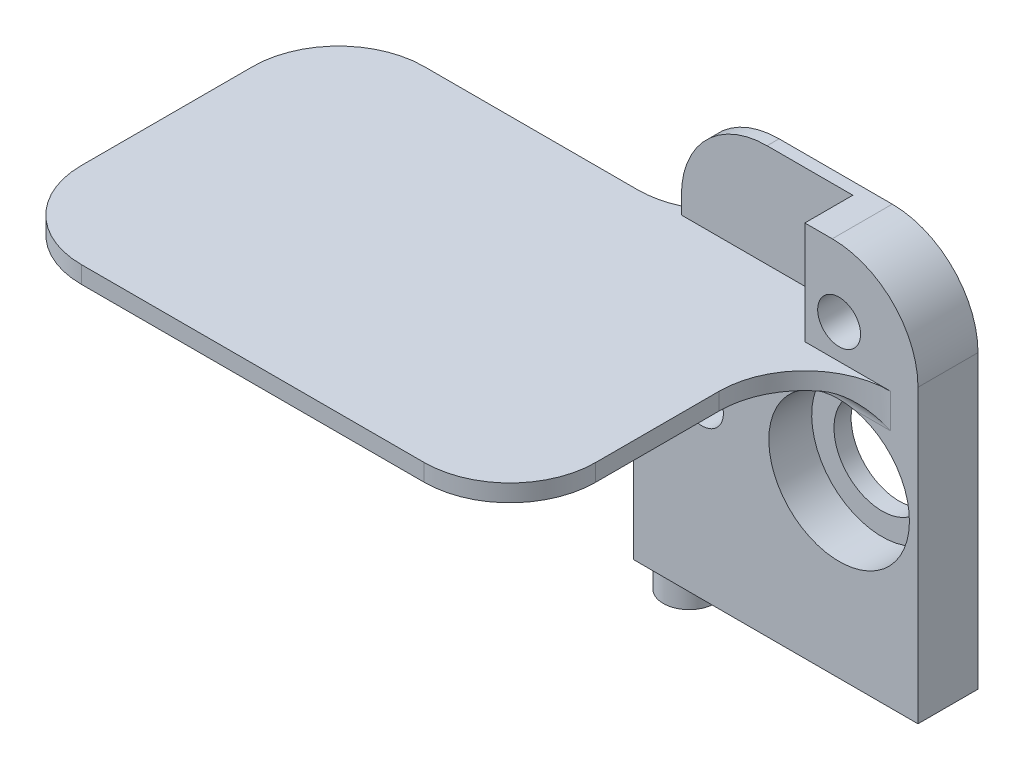
ISO-10303-21;
HEADER;
FILE_DESCRIPTION(('STEP AP214'),'2;1');
FILE_NAME('part.step','',(''),(''),'','','');
FILE_SCHEMA(('AUTOMOTIVE_DESIGN { 1 0 10303 214 1 1 1 1 }'));
ENDSEC;
DATA;
#1=APPLICATION_CONTEXT('core data for automotive mechanical design processes');
#2=APPLICATION_PROTOCOL_DEFINITION('international standard','automotive_design',2000,#1);
#3=PRODUCT_CONTEXT('',#1,'mechanical');
#4=PRODUCT('Part','Part','',(#3));
#5=PRODUCT_RELATED_PRODUCT_CATEGORY('part','',(#4));
#6=PRODUCT_DEFINITION_FORMATION('','',#4);
#7=PRODUCT_DEFINITION_CONTEXT('part definition',#1,'design');
#8=PRODUCT_DEFINITION('design','',#6,#7);
#9=PRODUCT_DEFINITION_SHAPE('','',#8);
#10=(LENGTH_UNIT() NAMED_UNIT(*) SI_UNIT(.MILLI.,.METRE.));
#11=(NAMED_UNIT(*) PLANE_ANGLE_UNIT() SI_UNIT($,.RADIAN.));
#12=(NAMED_UNIT(*) SI_UNIT($,.STERADIAN.) SOLID_ANGLE_UNIT());
#13=UNCERTAINTY_MEASURE_WITH_UNIT(LENGTH_MEASURE(1.E-05),#10,'distance_accuracy_value','');
#14=(GEOMETRIC_REPRESENTATION_CONTEXT(3) GLOBAL_UNCERTAINTY_ASSIGNED_CONTEXT((#13)) GLOBAL_UNIT_ASSIGNED_CONTEXT((#10,
#11,#12)) REPRESENTATION_CONTEXT('',''));
#15=CARTESIAN_POINT('',(0.,0.,0.));
#16=DIRECTION('',(0.,0.,1.));
#17=DIRECTION('',(1.,0.,0.));
#18=AXIS2_PLACEMENT_3D('',#15,#16,#17);
#19=CARTESIAN_POINT('',(-12.,0.,3.5));
#20=DIRECTION('',(1.,0.,0.));
#21=DIRECTION('',(0.,1.,0.));
#22=AXIS2_PLACEMENT_3D('',#19,#20,#21);
#23=PLANE('',#22);
#24=DIRECTION('',(0.,-1.,0.));
#25=VECTOR('',#24,1.);
#26=CARTESIAN_POINT('',(-12.,0.,3.5));
#27=LINE('',#26,#25);
#28=CARTESIAN_POINT('',(-12.,0.,3.5));
#29=VERTEX_POINT('',#28);
#30=CARTESIAN_POINT('',(-12.,-10.,3.5));
#31=VERTEX_POINT('',#30);
#32=EDGE_CURVE('E302',#29,#31,#27,.T.);
#33=ORIENTED_EDGE('',*,*,#32,.F.);
#34=DIRECTION('',(0.,0.,-1.));
#35=VECTOR('',#34,1.);
#36=CARTESIAN_POINT('',(-12.,0.,3.5));
#37=LINE('',#36,#35);
#38=CARTESIAN_POINT('',(-12.,0.,0.));
#39=VERTEX_POINT('',#38);
#40=EDGE_CURVE('E221',#29,#39,#37,.T.);
#41=ORIENTED_EDGE('',*,*,#40,.T.);
#42=DIRECTION('',(0.,-1.,0.));
#43=VECTOR('',#42,1.);
#44=CARTESIAN_POINT('',(-12.,0.,0.));
#45=LINE('',#44,#43);
#46=CARTESIAN_POINT('',(-12.,-10.,0.));
#47=VERTEX_POINT('',#46);
#48=EDGE_CURVE('E323',#39,#47,#45,.T.);
#49=ORIENTED_EDGE('',*,*,#48,.T.);
#50=DIRECTION('',(0.,0.,-1.));
#51=VECTOR('',#50,1.);
#52=CARTESIAN_POINT('',(-12.,-10.,3.5));
#53=LINE('',#52,#51);
#54=CARTESIAN_POINT('',(-12.,-10.,1.75));
#55=VERTEX_POINT('',#54);
#56=EDGE_CURVE('E333',#55,#47,#53,.T.);
#57=ORIENTED_EDGE('',*,*,#56,.F.);
#58=EDGE_CURVE('E334',#31,#55,#53,.T.);
#59=ORIENTED_EDGE('',*,*,#58,.F.);
#60=EDGE_LOOP('',(#33,#41,#49,#57,#59));
#61=FACE_BOUND('',#60,.T.);
#62=ADVANCED_FACE('F45',(#61),#23,.F.);
#63=CARTESIAN_POINT('',(4.6,0.,3.5));
#64=DIRECTION('',(1.,0.,0.));
#65=DIRECTION('',(0.,1.,0.));
#66=AXIS2_PLACEMENT_3D('',#63,#64,#65);
#67=PLANE('',#66);
#68=DIRECTION('',(0.,-1.,0.));
#69=VECTOR('',#68,1.);
#70=CARTESIAN_POINT('',(4.6,0.,0.));
#71=LINE('',#70,#69);
#72=CARTESIAN_POINT('',(4.6,7.,0.));
#73=VERTEX_POINT('',#72);
#74=CARTESIAN_POINT('',(4.6,-10.,0.));
#75=VERTEX_POINT('',#74);
#76=EDGE_CURVE('E317',#73,#75,#71,.T.);
#77=ORIENTED_EDGE('',*,*,#76,.F.);
#78=DIRECTION('',(0.,0.,-1.));
#79=VECTOR('',#78,1.);
#80=CARTESIAN_POINT('',(4.6,7.,3.5));
#81=LINE('',#80,#79);
#82=CARTESIAN_POINT('',(4.6,7.,3.5));
#83=VERTEX_POINT('',#82);
#84=EDGE_CURVE('E348',#73,#83,#81,.F.);
#85=ORIENTED_EDGE('',*,*,#84,.T.);
#86=DIRECTION('',(0.,-1.,0.));
#87=VECTOR('',#86,1.);
#88=CARTESIAN_POINT('',(4.6,0.,3.5));
#89=LINE('',#88,#87);
#90=CARTESIAN_POINT('',(4.6,-10.,3.5));
#91=VERTEX_POINT('',#90);
#92=EDGE_CURVE('E296',#83,#91,#89,.T.);
#93=ORIENTED_EDGE('',*,*,#92,.T.);
#94=DIRECTION('',(0.,0.,-1.));
#95=VECTOR('',#94,1.);
#96=CARTESIAN_POINT('',(4.6,-10.,3.5));
#97=LINE('',#96,#95);
#98=EDGE_CURVE('E309',#91,#75,#97,.T.);
#99=ORIENTED_EDGE('',*,*,#98,.T.);
#100=EDGE_LOOP('',(#77,#85,#93,#99));
#101=FACE_BOUND('',#100,.T.);
#102=ADVANCED_FACE('F521',(#101),#67,.T.);
#103=CARTESIAN_POINT('',(0.,12.,3.5));
#104=DIRECTION('',(0.,1.,0.));
#105=DIRECTION('',(0.,0.,1.));
#106=AXIS2_PLACEMENT_3D('',#103,#104,#105);
#107=PLANE('',#106);
#108=DIRECTION('',(1.,0.,0.));
#109=VECTOR('',#108,1.);
#110=CARTESIAN_POINT('',(0.,12.,0.));
#111=LINE('',#110,#109);
#112=CARTESIAN_POINT('',(-7.,12.,0.));
#113=VERTEX_POINT('',#112);
#114=CARTESIAN_POINT('',(-0.400000000000001,12.,0.));
#115=VERTEX_POINT('',#114);
#116=EDGE_CURVE('E320',#113,#115,#111,.T.);
#117=ORIENTED_EDGE('',*,*,#116,.F.);
#118=DIRECTION('',(0.,0.,-1.));
#119=VECTOR('',#118,1.);
#120=CARTESIAN_POINT('',(-7.,12.,0.7));
#121=LINE('',#120,#119);
#122=CARTESIAN_POINT('',(-7.,12.,0.7));
#123=VERTEX_POINT('',#122);
#124=EDGE_CURVE('E417',#113,#123,#121,.F.);
#125=ORIENTED_EDGE('',*,*,#124,.T.);
#126=DIRECTION('',(-1.,0.,0.));
#127=VECTOR('',#126,1.);
#128=CARTESIAN_POINT('',(-12.,12.,0.7));
#129=LINE('',#128,#127);
#130=CARTESIAN_POINT('',(-2.,12.,0.7));
#131=VERTEX_POINT('',#130);
#132=EDGE_CURVE('E244',#131,#123,#129,.T.);
#133=ORIENTED_EDGE('',*,*,#132,.F.);
#134=DIRECTION('',(0.,0.,1.));
#135=VECTOR('',#134,1.);
#136=CARTESIAN_POINT('',(-2.,12.,0.7));
#137=LINE('',#136,#135);
#138=CARTESIAN_POINT('',(-2.,12.,3.5));
#139=VERTEX_POINT('',#138);
#140=EDGE_CURVE('E253',#131,#139,#137,.T.);
#141=ORIENTED_EDGE('',*,*,#140,.T.);
#142=DIRECTION('',(1.,0.,0.));
#143=VECTOR('',#142,1.);
#144=CARTESIAN_POINT('',(0.,12.,3.5));
#145=LINE('',#144,#143);
#146=CARTESIAN_POINT('',(-0.400000000000001,12.,3.5));
#147=VERTEX_POINT('',#146);
#148=EDGE_CURVE('E299',#139,#147,#145,.T.);
#149=ORIENTED_EDGE('',*,*,#148,.T.);
#150=DIRECTION('',(0.,0.,-1.));
#151=VECTOR('',#150,1.);
#152=CARTESIAN_POINT('',(-0.400000000000001,12.,3.5));
#153=LINE('',#152,#151);
#154=EDGE_CURVE('E341',#147,#115,#153,.T.);
#155=ORIENTED_EDGE('',*,*,#154,.T.);
#156=EDGE_LOOP('',(#117,#125,#133,#141,#149,#155));
#157=FACE_BOUND('',#156,.T.);
#158=ADVANCED_FACE('F518',(#157),#107,.T.);
#159=CARTESIAN_POINT('',(-12.,7.,0.));
#160=VERTEX_POINT('',#159);
#161=CARTESIAN_POINT('',(-12.,6.,0.));
#162=VERTEX_POINT('',#161);
#163=EDGE_CURVE('E215',#160,#162,#45,.T.);
#164=ORIENTED_EDGE('',*,*,#163,.T.);
#165=DIRECTION('',(0.,0.,1.));
#166=VECTOR('',#165,1.);
#167=CARTESIAN_POINT('',(-12.,6.,0.7));
#168=LINE('',#167,#166);
#169=CARTESIAN_POINT('',(-12.,6.,0.700000000000001));
#170=VERTEX_POINT('',#169);
#171=EDGE_CURVE('E208',#162,#170,#168,.T.);
#172=ORIENTED_EDGE('',*,*,#171,.T.);
#173=DIRECTION('',(0.,-1.,0.));
#174=VECTOR('',#173,1.);
#175=CARTESIAN_POINT('',(-12.,12.,0.7));
#176=LINE('',#175,#174);
#177=CARTESIAN_POINT('',(-12.,7.,0.7));
#178=VERTEX_POINT('',#177);
#179=EDGE_CURVE('E212',#178,#170,#176,.T.);
#180=ORIENTED_EDGE('',*,*,#179,.F.);
#181=DIRECTION('',(0.,0.,-1.));
#182=VECTOR('',#181,1.);
#183=CARTESIAN_POINT('',(-12.,7.,0.));
#184=LINE('',#183,#182);
#185=EDGE_CURVE('E222',#178,#160,#184,.T.);
#186=ORIENTED_EDGE('',*,*,#185,.T.);
#187=EDGE_LOOP('',(#164,#172,#180,#186));
#188=FACE_BOUND('',#187,.T.);
#189=ADVANCED_FACE('F210',(#188),#23,.F.);
#190=CARTESIAN_POINT('',(0.,0.,3.5));
#191=DIRECTION('',(0.,0.,-1.));
#192=DIRECTION('',(-1.,0.,0.));
#193=AXIS2_PLACEMENT_3D('',#190,#191,#192);
#194=CYLINDRICAL_SURFACE('',#193,4.1);
#195=CARTESIAN_POINT('',(0.,0.,1.));
#196=DIRECTION('',(0.,0.,1.));
#197=DIRECTION('',(1.,0.,0.));
#198=AXIS2_PLACEMENT_3D('',#195,#196,#197);
#199=CIRCLE('',#198,4.1);
#200=CARTESIAN_POINT('',(4.1,0.,1.));
#201=VERTEX_POINT('',#200);
#202=EDGE_CURVE('E337',#201,#201,#199,.T.);
#203=ORIENTED_EDGE('',*,*,#202,.F.);
#204=EDGE_LOOP('',(#203));
#205=FACE_BOUND('',#204,.T.);
#206=CARTESIAN_POINT('',(0.,0.,3.5));
#207=DIRECTION('',(0.,0.,1.));
#208=DIRECTION('',(1.,0.,0.));
#209=AXIS2_PLACEMENT_3D('',#206,#207,#208);
#210=CIRCLE('',#209,4.1);
#211=CARTESIAN_POINT('',(-0.899999999999999,4.,3.5));
#212=VERTEX_POINT('',#211);
#213=CARTESIAN_POINT('',(0.899999999999999,4.,3.5));
#214=VERTEX_POINT('',#213);
#215=EDGE_CURVE('E293',#212,#214,#210,.T.);
#216=ORIENTED_EDGE('',*,*,#215,.T.);
#217=CARTESIAN_POINT('',(0.899999999999999,4.,3.5));
#218=CARTESIAN_POINT('',(0.843338002716587,4.01274966708049,3.50000889288666));
#219=CARTESIAN_POINT('',(0.786406378742301,4.02429364439797,3.50024403855192));
#220=CARTESIAN_POINT('',(0.672105018027952,4.04495319192239,3.50095510193643));
#221=CARTESIAN_POINT('',(0.614735277374627,4.05406874041242,3.50143102180876));
#222=CARTESIAN_POINT('',(0.499631741445202,4.06985802859775,3.50241213188354));
#223=CARTESIAN_POINT('',(0.441897782059741,4.07653057362082,3.50291733626715));
#224=CARTESIAN_POINT('',(0.326201922313624,4.08741595021869,3.5038136057697));
#225=CARTESIAN_POINT('',(0.268240025973177,4.09162882498148,3.50420467289265));
#226=CARTESIAN_POINT('',(0.0962836886650417,4.10045575123354,3.50503642074512));
#227=CARTESIAN_POINT('',(-0.0179117120112229,4.10154837053208,3.50516213594722));
#228=CARTESIAN_POINT('',(-0.245927834899043,4.09420593880846,3.50444085556565));
#229=CARTESIAN_POINT('',(-0.359748743294368,4.08577670419844,3.50359445379309));
#230=CARTESIAN_POINT('',(-0.508754754213375,4.06847230470813,3.50233952578956));
#231=CARTESIAN_POINT('',(-0.544467552749393,4.06384697406435,3.50202755596759));
#232=CARTESIAN_POINT('',(-0.615754568933121,4.05365785368792,3.50142727416294));
#233=CARTESIAN_POINT('',(-0.651328810592354,4.04809423470406,3.50113895788995));
#234=CARTESIAN_POINT('',(-0.722526779044182,4.03599636750958,3.50062963110182));
#235=CARTESIAN_POINT('',(-0.758149570924331,4.02945661436444,3.50040902553146));
#236=CARTESIAN_POINT('',(-0.82921658002874,4.01543423032174,3.50009483496549));
#237=CARTESIAN_POINT('',(-0.864660762423561,4.00795142240238,3.50000127385644));
#238=CARTESIAN_POINT('',(-0.899999999999998,4.,3.5));
#239=B_SPLINE_CURVE_WITH_KNOTS('',3,(#217,#218,#219,#220,#221,#222,#223,#224,#225,#226,#227,
#228,#229,#230,#231,#232,#233,#234,#235,#236,#237,#238),.UNSPECIFIED.,.F.,.F.,(4,2,2,2,2,2,2,2,
2,2,4),(0.,0.174220167149717,0.348441892260287,0.522748701463882,0.697052450019111,
1.03923050237246,1.38119964867944,1.48922906809211,1.59723884958742,1.70588253468397,
1.81454664386023),.UNSPECIFIED.);
#240=EDGE_CURVE('E60',#214,#212,#239,.T.);
#241=ORIENTED_EDGE('',*,*,#240,.T.);
#242=EDGE_LOOP('',(#216,#241));
#243=FACE_BOUND('',#242,.T.);
#244=ADVANCED_FACE('F517',(#205,#243),#194,.F.);
#245=CARTESIAN_POINT('',(0.,8.,3.5));
#246=DIRECTION('',(0.,0.,-1.));
#247=DIRECTION('',(-1.,0.,0.));
#248=AXIS2_PLACEMENT_3D('',#245,#246,#247);
#249=CYLINDRICAL_SURFACE('',#248,1.25);
#250=CARTESIAN_POINT('',(0.,8.,3.5));
#251=DIRECTION('',(0.,0.,1.));
#252=DIRECTION('',(1.,0.,0.));
#253=AXIS2_PLACEMENT_3D('',#250,#251,#252);
#254=CIRCLE('',#253,1.25);
#255=CARTESIAN_POINT('',(1.25,8.,3.5));
#256=VERTEX_POINT('',#255);
#257=EDGE_CURVE('E288',#256,#256,#254,.T.);
#258=ORIENTED_EDGE('',*,*,#257,.T.);
#259=EDGE_LOOP('',(#258));
#260=FACE_BOUND('',#259,.T.);
#261=CARTESIAN_POINT('',(0.,8.,0.));
#262=DIRECTION('',(0.,0.,1.));
#263=DIRECTION('',(1.,0.,0.));
#264=AXIS2_PLACEMENT_3D('',#261,#262,#263);
#265=CIRCLE('',#264,1.25);
#266=CARTESIAN_POINT('',(1.25,8.,0.));
#267=VERTEX_POINT('',#266);
#268=EDGE_CURVE('E313',#267,#267,#265,.T.);
#269=ORIENTED_EDGE('',*,*,#268,.F.);
#270=EDGE_LOOP('',(#269));
#271=FACE_BOUND('',#270,.T.);
#272=ADVANCED_FACE('F529',(#260,#271),#249,.F.);
#273=CARTESIAN_POINT('',(-8.,0.,3.5));
#274=DIRECTION('',(0.,0.,-1.));
#275=DIRECTION('',(-1.,0.,0.));
#276=AXIS2_PLACEMENT_3D('',#273,#274,#275);
#277=CYLINDRICAL_SURFACE('',#276,1.25);
#278=CARTESIAN_POINT('',(-8.,0.,3.5));
#279=DIRECTION('',(0.,0.,1.));
#280=DIRECTION('',(1.,0.,0.));
#281=AXIS2_PLACEMENT_3D('',#278,#279,#280);
#282=CIRCLE('',#281,1.25);
#283=CARTESIAN_POINT('',(-6.75,0.,3.5));
#284=VERTEX_POINT('',#283);
#285=EDGE_CURVE('E284',#284,#284,#282,.T.);
#286=ORIENTED_EDGE('',*,*,#285,.T.);
#287=EDGE_LOOP('',(#286));
#288=FACE_BOUND('',#287,.T.);
#289=CARTESIAN_POINT('',(-8.,0.,0.));
#290=DIRECTION('',(0.,0.,1.));
#291=DIRECTION('',(1.,0.,0.));
#292=AXIS2_PLACEMENT_3D('',#289,#290,#291);
#293=CIRCLE('',#292,1.25);
#294=CARTESIAN_POINT('',(-6.75,0.,0.));
#295=VERTEX_POINT('',#294);
#296=EDGE_CURVE('E280',#295,#295,#293,.T.);
#297=ORIENTED_EDGE('',*,*,#296,.F.);
#298=EDGE_LOOP('',(#297));
#299=FACE_BOUND('',#298,.T.);
#300=ADVANCED_FACE('F513',(#288,#299),#277,.F.);
#301=CARTESIAN_POINT('',(0.,-10.,3.5));
#302=DIRECTION('',(0.,1.,0.));
#303=DIRECTION('',(0.,0.,1.));
#304=AXIS2_PLACEMENT_3D('',#301,#302,#303);
#305=PLANE('',#304);
#306=CARTESIAN_POINT('',(-4.5,-10.,1.75));
#307=DIRECTION('',(0.,-1.,0.));
#308=DIRECTION('',(0.,0.,-1.));
#309=AXIS2_PLACEMENT_3D('',#306,#307,#308);
#310=CIRCLE('',#309,1.);
#311=CARTESIAN_POINT('',(-4.5,-10.,0.75));
#312=VERTEX_POINT('',#311);
#313=EDGE_CURVE('E264',#312,#312,#310,.T.);
#314=ORIENTED_EDGE('',*,*,#313,.F.);
#315=EDGE_LOOP('',(#314));
#316=FACE_BOUND('',#315,.T.);
#317=ORIENTED_EDGE('',*,*,#58,.T.);
#318=CARTESIAN_POINT('',(-10.5,-10.,1.75));
#319=DIRECTION('',(0.,-1.,0.));
#320=DIRECTION('',(0.,0.,-1.));
#321=AXIS2_PLACEMENT_3D('',#318,#319,#320);
#322=CIRCLE('',#321,1.5);
#323=EDGE_CURVE('E257',#55,#55,#322,.T.);
#324=ORIENTED_EDGE('',*,*,#323,.F.);
#325=ORIENTED_EDGE('',*,*,#56,.T.);
#326=DIRECTION('',(1.,0.,0.));
#327=VECTOR('',#326,1.);
#328=CARTESIAN_POINT('',(0.,-10.,0.));
#329=LINE('',#328,#327);
#330=EDGE_CURVE('E289',#47,#75,#329,.T.);
#331=ORIENTED_EDGE('',*,*,#330,.T.);
#332=ORIENTED_EDGE('',*,*,#98,.F.);
#333=DIRECTION('',(1.,0.,0.));
#334=VECTOR('',#333,1.);
#335=CARTESIAN_POINT('',(0.,-10.,3.5));
#336=LINE('',#335,#334);
#337=EDGE_CURVE('E305',#31,#91,#336,.T.);
#338=ORIENTED_EDGE('',*,*,#337,.F.);
#339=EDGE_LOOP('',(#317,#324,#325,#331,#332,#338));
#340=FACE_BOUND('',#339,.T.);
#341=ADVANCED_FACE('F506',(#316,#340),#305,.F.);
#342=CARTESIAN_POINT('',(0.,0.,3.5));
#343=DIRECTION('',(0.,0.,1.));
#344=DIRECTION('',(1.,0.,0.));
#345=AXIS2_PLACEMENT_3D('',#342,#343,#344);
#346=PLANE('',#345);
#347=ORIENTED_EDGE('',*,*,#285,.F.);
#348=EDGE_LOOP('',(#347));
#349=FACE_BOUND('',#348,.T.);
#350=ORIENTED_EDGE('',*,*,#257,.F.);
#351=EDGE_LOOP('',(#350));
#352=FACE_BOUND('',#351,.T.);
#353=DIRECTION('',(0.,1.,0.));
#354=VECTOR('',#353,1.);
#355=CARTESIAN_POINT('',(3.,5.,3.5));
#356=LINE('',#355,#354);
#357=CARTESIAN_POINT('',(3.,6.,3.5));
#358=VERTEX_POINT('',#357);
#359=CARTESIAN_POINT('',(3.,4.,3.5));
#360=VERTEX_POINT('',#359);
#361=EDGE_CURVE('E67',#358,#360,#356,.F.);
#362=ORIENTED_EDGE('',*,*,#361,.T.);
#363=DIRECTION('',(1.,0.,0.));
#364=VECTOR('',#363,1.);
#365=CARTESIAN_POINT('',(-17.,4.,3.5));
#366=LINE('',#365,#364);
#367=EDGE_CURVE('E546',#360,#214,#366,.F.);
#368=ORIENTED_EDGE('',*,*,#367,.T.);
#369=ORIENTED_EDGE('',*,*,#215,.F.);
#370=DIRECTION('',(1.,0.,0.));
#371=VECTOR('',#370,1.);
#372=CARTESIAN_POINT('',(-17.,4.,3.5));
#373=LINE('',#372,#371);
#374=CARTESIAN_POINT('',(-14.,4.,3.5));
#375=VERTEX_POINT('',#374);
#376=EDGE_CURVE('E592',#212,#375,#373,.F.);
#377=ORIENTED_EDGE('',*,*,#376,.T.);
#378=CARTESIAN_POINT('',(-17.,0.,3.5));
#379=DIRECTION('',(0.,0.,1.));
#380=DIRECTION('',(1.,0.,0.));
#381=AXIS2_PLACEMENT_3D('',#378,#379,#380);
#382=CIRCLE('',#381,5.);
#383=EDGE_CURVE('E425',#375,#29,#382,.F.);
#384=ORIENTED_EDGE('',*,*,#383,.T.);
#385=ORIENTED_EDGE('',*,*,#32,.T.);
#386=ORIENTED_EDGE('',*,*,#337,.T.);
#387=ORIENTED_EDGE('',*,*,#92,.F.);
#388=CARTESIAN_POINT('',(-0.400000000000001,7.,3.5));
#389=DIRECTION('',(0.,0.,1.));
#390=DIRECTION('',(1.,0.,0.));
#391=AXIS2_PLACEMENT_3D('',#388,#389,#390);
#392=CIRCLE('',#391,5.);
#393=EDGE_CURVE('E351',#83,#147,#392,.T.);
#394=ORIENTED_EDGE('',*,*,#393,.T.);
#395=ORIENTED_EDGE('',*,*,#148,.F.);
#396=DIRECTION('',(0.,1.,0.));
#397=VECTOR('',#396,1.);
#398=CARTESIAN_POINT('',(-2.,12.,3.5));
#399=LINE('',#398,#397);
#400=CARTESIAN_POINT('',(-2.,6.,3.5));
#401=VERTEX_POINT('',#400);
#402=EDGE_CURVE('E233',#401,#139,#399,.T.);
#403=ORIENTED_EDGE('',*,*,#402,.F.);
#404=DIRECTION('',(1.,0.,0.));
#405=VECTOR('',#404,1.);
#406=CARTESIAN_POINT('',(0.,6.,3.5));
#407=LINE('',#406,#405);
#408=EDGE_CURVE('E411',#401,#358,#407,.T.);
#409=ORIENTED_EDGE('',*,*,#408,.T.);
#410=EDGE_LOOP('',(#362,#368,#369,#377,#384,#385,#386,#387,#394,#395,#403,#409));
#411=FACE_BOUND('',#410,.T.);
#412=ADVANCED_FACE('F503',(#349,#352,#411),#346,.T.);
#413=CARTESIAN_POINT('',(0.,0.,0.));
#414=DIRECTION('',(0.,0.,1.));
#415=DIRECTION('',(1.,0.,0.));
#416=AXIS2_PLACEMENT_3D('',#413,#414,#415);
#417=PLANE('',#416);
#418=ORIENTED_EDGE('',*,*,#296,.T.);
#419=EDGE_LOOP('',(#418));
#420=FACE_BOUND('',#419,.T.);
#421=ORIENTED_EDGE('',*,*,#268,.T.);
#422=EDGE_LOOP('',(#421));
#423=FACE_BOUND('',#422,.T.);
#424=ORIENTED_EDGE('',*,*,#163,.F.);
#425=CARTESIAN_POINT('',(-7.,7.,0.));
#426=DIRECTION('',(0.,0.,1.));
#427=DIRECTION('',(1.,0.,0.));
#428=AXIS2_PLACEMENT_3D('',#425,#426,#427);
#429=CIRCLE('',#428,5.);
#430=EDGE_CURVE('E414',#160,#113,#429,.F.);
#431=ORIENTED_EDGE('',*,*,#430,.T.);
#432=ORIENTED_EDGE('',*,*,#116,.T.);
#433=CARTESIAN_POINT('',(-0.400000000000001,7.,0.));
#434=DIRECTION('',(0.,0.,1.));
#435=DIRECTION('',(1.,0.,0.));
#436=AXIS2_PLACEMENT_3D('',#433,#434,#435);
#437=CIRCLE('',#436,5.);
#438=EDGE_CURVE('E345',#115,#73,#437,.F.);
#439=ORIENTED_EDGE('',*,*,#438,.T.);
#440=ORIENTED_EDGE('',*,*,#76,.T.);
#441=ORIENTED_EDGE('',*,*,#330,.F.);
#442=ORIENTED_EDGE('',*,*,#48,.F.);
#443=EDGE_CURVE('E326',#162,#39,#45,.T.);
#444=ORIENTED_EDGE('',*,*,#443,.F.);
#445=EDGE_LOOP('',(#424,#431,#432,#439,#440,#441,#442,#444));
#446=FACE_BOUND('',#445,.T.);
#447=CARTESIAN_POINT('',(0.,0.,0.));
#448=DIRECTION('',(0.,0.,1.));
#449=DIRECTION('',(1.,0.,0.));
#450=AXIS2_PLACEMENT_3D('',#447,#448,#449);
#451=CIRCLE('',#450,2.8);
#452=CARTESIAN_POINT('',(2.8,0.,0.));
#453=VERTEX_POINT('',#452);
#454=EDGE_CURVE('E272',#453,#453,#451,.T.);
#455=ORIENTED_EDGE('',*,*,#454,.T.);
#456=EDGE_LOOP('',(#455));
#457=FACE_BOUND('',#456,.T.);
#458=ADVANCED_FACE('F501',(#420,#423,#446,#457),#417,.F.);
#459=CARTESIAN_POINT('',(0.,0.,1.));
#460=DIRECTION('',(0.,0.,-1.));
#461=DIRECTION('',(-1.,0.,0.));
#462=AXIS2_PLACEMENT_3D('',#459,#460,#461);
#463=CYLINDRICAL_SURFACE('',#462,2.8);
#464=CARTESIAN_POINT('',(0.,0.,1.));
#465=DIRECTION('',(0.,0.,1.));
#466=DIRECTION('',(1.,0.,0.));
#467=AXIS2_PLACEMENT_3D('',#464,#465,#466);
#468=CIRCLE('',#467,2.8);
#469=CARTESIAN_POINT('',(2.8,0.,1.));
#470=VERTEX_POINT('',#469);
#471=EDGE_CURVE('E276',#470,#470,#468,.T.);
#472=ORIENTED_EDGE('',*,*,#471,.T.);
#473=EDGE_LOOP('',(#472));
#474=FACE_BOUND('',#473,.T.);
#475=ORIENTED_EDGE('',*,*,#454,.F.);
#476=EDGE_LOOP('',(#475));
#477=FACE_BOUND('',#476,.T.);
#478=ADVANCED_FACE('F497',(#474,#477),#463,.F.);
#479=CARTESIAN_POINT('',(0.,0.,1.));
#480=DIRECTION('',(0.,0.,1.));
#481=DIRECTION('',(1.,0.,0.));
#482=AXIS2_PLACEMENT_3D('',#479,#480,#481);
#483=PLANE('',#482);
#484=ORIENTED_EDGE('',*,*,#471,.F.);
#485=EDGE_LOOP('',(#484));
#486=FACE_BOUND('',#485,.T.);
#487=ORIENTED_EDGE('',*,*,#202,.T.);
#488=EDGE_LOOP('',(#487));
#489=FACE_BOUND('',#488,.T.);
#490=ADVANCED_FACE('F494',(#486,#489),#483,.T.);
#491=CARTESIAN_POINT('',(-0.400000000000001,7.,3.5));
#492=DIRECTION('',(0.,0.,-1.));
#493=DIRECTION('',(-1.,0.,0.));
#494=AXIS2_PLACEMENT_3D('',#491,#492,#493);
#495=CYLINDRICAL_SURFACE('',#494,5.);
#496=ORIENTED_EDGE('',*,*,#393,.F.);
#497=ORIENTED_EDGE('',*,*,#84,.F.);
#498=ORIENTED_EDGE('',*,*,#438,.F.);
#499=ORIENTED_EDGE('',*,*,#154,.F.);
#500=EDGE_LOOP('',(#496,#497,#498,#499));
#501=FACE_BOUND('',#500,.T.);
#502=ADVANCED_FACE('F492',(#501),#495,.T.);
#503=CARTESIAN_POINT('',(-4.5,-4.,1.75));
#504=DIRECTION('',(0.,-1.,0.));
#505=DIRECTION('',(0.,0.,-1.));
#506=AXIS2_PLACEMENT_3D('',#503,#504,#505);
#507=CYLINDRICAL_SURFACE('',#506,1.);
#508=CARTESIAN_POINT('',(-4.5,-4.,1.75));
#509=DIRECTION('',(0.,-1.,0.));
#510=DIRECTION('',(0.,0.,-1.));
#511=AXIS2_PLACEMENT_3D('',#508,#509,#510);
#512=CIRCLE('',#511,1.);
#513=CARTESIAN_POINT('',(-4.5,-4.,0.75));
#514=VERTEX_POINT('',#513);
#515=EDGE_CURVE('E268',#514,#514,#512,.T.);
#516=ORIENTED_EDGE('',*,*,#515,.F.);
#517=EDGE_LOOP('',(#516));
#518=FACE_BOUND('',#517,.T.);
#519=ORIENTED_EDGE('',*,*,#313,.T.);
#520=EDGE_LOOP('',(#519));
#521=FACE_BOUND('',#520,.T.);
#522=ADVANCED_FACE('F488',(#518,#521),#507,.F.);
#523=CARTESIAN_POINT('',(0.,-4.,0.));
#524=DIRECTION('',(0.,-1.,0.));
#525=DIRECTION('',(0.,0.,-1.));
#526=AXIS2_PLACEMENT_3D('',#523,#524,#525);
#527=PLANE('',#526);
#528=ORIENTED_EDGE('',*,*,#515,.T.);
#529=EDGE_LOOP('',(#528));
#530=FACE_BOUND('',#529,.T.);
#531=ADVANCED_FACE('F484',(#530),#527,.T.);
#532=CARTESIAN_POINT('',(-10.5,-11.6,1.75));
#533=DIRECTION('',(0.,1.,0.));
#534=DIRECTION('',(0.,0.,1.));
#535=AXIS2_PLACEMENT_3D('',#532,#533,#534);
#536=CYLINDRICAL_SURFACE('',#535,1.5);
#537=CARTESIAN_POINT('',(-10.5,-11.6,1.75));
#538=DIRECTION('',(0.,-1.,0.));
#539=DIRECTION('',(0.,0.,-1.));
#540=AXIS2_PLACEMENT_3D('',#537,#538,#539);
#541=CIRCLE('',#540,1.5);
#542=CARTESIAN_POINT('',(-10.5,-11.6,0.249999999999999));
#543=VERTEX_POINT('',#542);
#544=EDGE_CURVE('E260',#543,#543,#541,.T.);
#545=ORIENTED_EDGE('',*,*,#544,.F.);
#546=EDGE_LOOP('',(#545));
#547=FACE_BOUND('',#546,.T.);
#548=ORIENTED_EDGE('',*,*,#323,.T.);
#549=EDGE_LOOP('',(#548));
#550=FACE_BOUND('',#549,.T.);
#551=ADVANCED_FACE('F480',(#547,#550),#536,.T.);
#552=CARTESIAN_POINT('',(0.,-11.6,0.));
#553=DIRECTION('',(0.,-1.,0.));
#554=DIRECTION('',(0.,0.,-1.));
#555=AXIS2_PLACEMENT_3D('',#552,#553,#554);
#556=PLANE('',#555);
#557=ORIENTED_EDGE('',*,*,#544,.T.);
#558=EDGE_LOOP('',(#557));
#559=FACE_BOUND('',#558,.T.);
#560=ADVANCED_FACE('F474',(#559),#556,.T.);
#561=CARTESIAN_POINT('',(-2.,12.,0.7));
#562=DIRECTION('',(1.,0.,0.));
#563=DIRECTION('',(0.,1.,0.));
#564=AXIS2_PLACEMENT_3D('',#561,#562,#563);
#565=PLANE('',#564);
#566=ORIENTED_EDGE('',*,*,#402,.T.);
#567=ORIENTED_EDGE('',*,*,#140,.F.);
#568=DIRECTION('',(0.,1.,0.));
#569=VECTOR('',#568,1.);
#570=CARTESIAN_POINT('',(-2.,12.,0.7));
#571=LINE('',#570,#569);
#572=CARTESIAN_POINT('',(-2.,6.,0.7));
#573=VERTEX_POINT('',#572);
#574=EDGE_CURVE('E241',#573,#131,#571,.T.);
#575=ORIENTED_EDGE('',*,*,#574,.F.);
#576=DIRECTION('',(0.,0.,1.));
#577=VECTOR('',#576,1.);
#578=CARTESIAN_POINT('',(-2.,6.,0.7));
#579=LINE('',#578,#577);
#580=EDGE_CURVE('E238',#573,#401,#579,.T.);
#581=ORIENTED_EDGE('',*,*,#580,.T.);
#582=EDGE_LOOP('',(#566,#567,#575,#581));
#583=FACE_BOUND('',#582,.T.);
#584=ADVANCED_FACE('F471',(#583),#565,.F.);
#585=CARTESIAN_POINT('',(-12.,6.,0.7));
#586=DIRECTION('',(0.,-1.,0.));
#587=DIRECTION('',(0.,0.,-1.));
#588=AXIS2_PLACEMENT_3D('',#585,#586,#587);
#589=PLANE('',#588);
#590=DIRECTION('',(-1.,0.,0.));
#591=VECTOR('',#590,1.);
#592=CARTESIAN_POINT('',(-2.,6.,0.7));
#593=LINE('',#592,#591);
#594=CARTESIAN_POINT('',(-14.5514701644346,6.,0.700000000000002));
#595=VERTEX_POINT('',#594);
#596=CARTESIAN_POINT('',(-27.,6.,0.700000000000003));
#597=VERTEX_POINT('',#596);
#598=EDGE_CURVE('E623',#595,#597,#593,.T.);
#599=ORIENTED_EDGE('',*,*,#598,.T.);
#600=CARTESIAN_POINT('',(-27.,6.,5.7));
#601=DIRECTION('',(0.,-1.,0.));
#602=DIRECTION('',(0.,0.,-1.));
#603=AXIS2_PLACEMENT_3D('',#600,#601,#602);
#604=CIRCLE('',#603,5.);
#605=CARTESIAN_POINT('',(-32.,6.,5.7));
#606=VERTEX_POINT('',#605);
#607=EDGE_CURVE('E368',#597,#606,#604,.F.);
#608=ORIENTED_EDGE('',*,*,#607,.T.);
#609=DIRECTION('',(0.,0.,1.));
#610=VECTOR('',#609,1.);
#611=CARTESIAN_POINT('',(-32.,6.,0.700000000000004));
#612=LINE('',#611,#610);
#613=CARTESIAN_POINT('',(-32.,6.,15.7));
#614=VERTEX_POINT('',#613);
#615=EDGE_CURVE('E626',#606,#614,#612,.T.);
#616=ORIENTED_EDGE('',*,*,#615,.T.);
#617=CARTESIAN_POINT('',(-27.,6.,15.7));
#618=DIRECTION('',(0.,-1.,0.));
#619=DIRECTION('',(0.,0.,-1.));
#620=AXIS2_PLACEMENT_3D('',#617,#618,#619);
#621=CIRCLE('',#620,5.);
#622=CARTESIAN_POINT('',(-27.,6.,20.7));
#623=VERTEX_POINT('',#622);
#624=EDGE_CURVE('E365',#614,#623,#621,.F.);
#625=ORIENTED_EDGE('',*,*,#624,.T.);
#626=DIRECTION('',(1.,0.,0.));
#627=VECTOR('',#626,1.);
#628=CARTESIAN_POINT('',(-2.,6.,20.7));
#629=LINE('',#628,#627);
#630=CARTESIAN_POINT('',(-7.,6.,20.7));
#631=VERTEX_POINT('',#630);
#632=EDGE_CURVE('E614',#623,#631,#629,.T.);
#633=ORIENTED_EDGE('',*,*,#632,.T.);
#634=CARTESIAN_POINT('',(-7.,6.,15.7));
#635=DIRECTION('',(0.,-1.,0.));
#636=DIRECTION('',(0.,0.,-1.));
#637=AXIS2_PLACEMENT_3D('',#634,#635,#636);
#638=CIRCLE('',#637,5.);
#639=CARTESIAN_POINT('',(-2.,6.,15.7));
#640=VERTEX_POINT('',#639);
#641=EDGE_CURVE('E362',#631,#640,#638,.F.);
#642=ORIENTED_EDGE('',*,*,#641,.T.);
#643=DIRECTION('',(0.,0.,-1.));
#644=VECTOR('',#643,1.);
#645=CARTESIAN_POINT('',(-2.,6.,0.7));
#646=LINE('',#645,#644);
#647=CARTESIAN_POINT('',(-2.,6.,8.5));
#648=VERTEX_POINT('',#647);
#649=EDGE_CURVE('E581',#640,#648,#646,.T.);
#650=ORIENTED_EDGE('',*,*,#649,.T.);
#651=CARTESIAN_POINT('',(3.,6.,8.5));
#652=DIRECTION('',(0.,-1.,0.));
#653=DIRECTION('',(0.,0.,-1.));
#654=AXIS2_PLACEMENT_3D('',#651,#652,#653);
#655=CIRCLE('',#654,5.);
#656=EDGE_CURVE('E428',#648,#358,#655,.T.);
#657=ORIENTED_EDGE('',*,*,#656,.T.);
#658=ORIENTED_EDGE('',*,*,#408,.F.);
#659=ORIENTED_EDGE('',*,*,#580,.F.);
#660=DIRECTION('',(1.,0.,0.));
#661=VECTOR('',#660,1.);
#662=CARTESIAN_POINT('',(-12.,6.,0.7));
#663=LINE('',#662,#661);
#664=EDGE_CURVE('E229',#170,#573,#663,.T.);
#665=ORIENTED_EDGE('',*,*,#664,.F.);
#666=ORIENTED_EDGE('',*,*,#171,.F.);
#667=CARTESIAN_POINT('',(-14.5514701644346,6.,-4.3));
#668=DIRECTION('',(0.,-1.,0.));
#669=DIRECTION('',(0.,0.,-1.));
#670=AXIS2_PLACEMENT_3D('',#667,#668,#669);
#671=CIRCLE('',#670,5.);
#672=EDGE_CURVE('E434',#162,#595,#671,.T.);
#673=ORIENTED_EDGE('',*,*,#672,.T.);
#674=EDGE_LOOP('',(#599,#608,#616,#625,#633,#642,#650,#657,#658,#659,#665,#666,#673));
#675=FACE_BOUND('',#674,.T.);
#676=ADVANCED_FACE('F236',(#675),#589,.F.);
#677=CARTESIAN_POINT('',(0.,0.,0.7));
#678=DIRECTION('',(0.,0.,1.));
#679=DIRECTION('',(1.,0.,0.));
#680=AXIS2_PLACEMENT_3D('',#677,#678,#679);
#681=PLANE('',#680);
#682=ORIENTED_EDGE('',*,*,#132,.T.);
#683=CARTESIAN_POINT('',(-7.,7.,0.7));
#684=DIRECTION('',(0.,0.,1.));
#685=DIRECTION('',(1.,0.,0.));
#686=AXIS2_PLACEMENT_3D('',#683,#684,#685);
#687=CIRCLE('',#686,5.);
#688=EDGE_CURVE('E231',#123,#178,#687,.T.);
#689=ORIENTED_EDGE('',*,*,#688,.T.);
#690=ORIENTED_EDGE('',*,*,#179,.T.);
#691=ORIENTED_EDGE('',*,*,#664,.T.);
#692=ORIENTED_EDGE('',*,*,#574,.T.);
#693=EDGE_LOOP('',(#682,#689,#690,#691,#692));
#694=FACE_BOUND('',#693,.T.);
#695=ADVANCED_FACE('F227',(#694),#681,.T.);
#696=CARTESIAN_POINT('',(0.,5.,0.));
#697=DIRECTION('',(0.,-1.,0.));
#698=DIRECTION('',(0.,0.,-1.));
#699=AXIS2_PLACEMENT_3D('',#696,#697,#698);
#700=PLANE('',#699);
#701=DIRECTION('',(0.,0.,-1.));
#702=VECTOR('',#701,1.);
#703=CARTESIAN_POINT('',(-17.,5.,0.));
#704=LINE('',#703,#702);
#705=CARTESIAN_POINT('',(-17.,5.,0.700000000000002));
#706=VERTEX_POINT('',#705);
#707=CARTESIAN_POINT('',(-17.,5.,4.5));
#708=VERTEX_POINT('',#707);
#709=EDGE_CURVE('E378',#706,#708,#704,.F.);
#710=ORIENTED_EDGE('',*,*,#709,.T.);
#711=DIRECTION('',(1.,0.,0.));
#712=VECTOR('',#711,1.);
#713=CARTESIAN_POINT('',(3.,5.,4.5));
#714=LINE('',#713,#712);
#715=CARTESIAN_POINT('',(0.,5.,4.5));
#716=VERTEX_POINT('',#715);
#717=EDGE_CURVE('E442',#708,#716,#714,.T.);
#718=ORIENTED_EDGE('',*,*,#717,.T.);
#719=CARTESIAN_POINT('',(3.,5.,8.5));
#720=DIRECTION('',(0.,-1.,0.));
#721=DIRECTION('',(0.,0.,-1.));
#722=AXIS2_PLACEMENT_3D('',#719,#720,#721);
#723=CIRCLE('',#722,5.);
#724=CARTESIAN_POINT('',(-2.,5.,8.5));
#725=VERTEX_POINT('',#724);
#726=EDGE_CURVE('E431',#716,#725,#723,.F.);
#727=ORIENTED_EDGE('',*,*,#726,.T.);
#728=DIRECTION('',(0.,0.,-1.));
#729=VECTOR('',#728,1.);
#730=CARTESIAN_POINT('',(-2.,5.,0.7));
#731=LINE('',#730,#729);
#732=CARTESIAN_POINT('',(-2.,5.,15.7));
#733=VERTEX_POINT('',#732);
#734=EDGE_CURVE('E607',#733,#725,#731,.T.);
#735=ORIENTED_EDGE('',*,*,#734,.F.);
#736=CARTESIAN_POINT('',(-7.,5.,15.7));
#737=DIRECTION('',(0.,-1.,0.));
#738=DIRECTION('',(0.,0.,-1.));
#739=AXIS2_PLACEMENT_3D('',#736,#737,#738);
#740=CIRCLE('',#739,5.);
#741=CARTESIAN_POINT('',(-7.,5.,20.7));
#742=VERTEX_POINT('',#741);
#743=EDGE_CURVE('E381',#733,#742,#740,.T.);
#744=ORIENTED_EDGE('',*,*,#743,.T.);
#745=DIRECTION('',(1.,0.,0.));
#746=VECTOR('',#745,1.);
#747=CARTESIAN_POINT('',(-2.,5.,20.7));
#748=LINE('',#747,#746);
#749=CARTESIAN_POINT('',(-27.,5.,20.7));
#750=VERTEX_POINT('',#749);
#751=EDGE_CURVE('E252',#750,#742,#748,.T.);
#752=ORIENTED_EDGE('',*,*,#751,.F.);
#753=CARTESIAN_POINT('',(-27.,5.,15.7));
#754=DIRECTION('',(0.,-1.,0.));
#755=DIRECTION('',(0.,0.,-1.));
#756=AXIS2_PLACEMENT_3D('',#753,#754,#755);
#757=CIRCLE('',#756,5.);
#758=CARTESIAN_POINT('',(-32.,5.,15.7));
#759=VERTEX_POINT('',#758);
#760=EDGE_CURVE('E384',#750,#759,#757,.T.);
#761=ORIENTED_EDGE('',*,*,#760,.T.);
#762=DIRECTION('',(0.,0.,1.));
#763=VECTOR('',#762,1.);
#764=CARTESIAN_POINT('',(-32.,5.,0.700000000000004));
#765=LINE('',#764,#763);
#766=CARTESIAN_POINT('',(-32.,5.,5.7));
#767=VERTEX_POINT('',#766);
#768=EDGE_CURVE('E606',#767,#759,#765,.T.);
#769=ORIENTED_EDGE('',*,*,#768,.F.);
#770=CARTESIAN_POINT('',(-27.,5.,5.7));
#771=DIRECTION('',(0.,-1.,0.));
#772=DIRECTION('',(0.,0.,-1.));
#773=AXIS2_PLACEMENT_3D('',#770,#771,#772);
#774=CIRCLE('',#773,5.);
#775=CARTESIAN_POINT('',(-27.,5.,0.700000000000003));
#776=VERTEX_POINT('',#775);
#777=EDGE_CURVE('E387',#767,#776,#774,.T.);
#778=ORIENTED_EDGE('',*,*,#777,.T.);
#779=DIRECTION('',(-1.,0.,0.));
#780=VECTOR('',#779,1.);
#781=CARTESIAN_POINT('',(-2.,5.,0.7));
#782=LINE('',#781,#780);
#783=EDGE_CURVE('E601',#706,#776,#782,.T.);
#784=ORIENTED_EDGE('',*,*,#783,.F.);
#785=EDGE_LOOP('',(#710,#718,#727,#735,#744,#752,#761,#769,#778,#784));
#786=FACE_BOUND('',#785,.T.);
#787=ADVANCED_FACE('F461',(#786),#700,.T.);
#788=CARTESIAN_POINT('',(-2.,5.,0.7));
#789=DIRECTION('',(0.,0.,-1.));
#790=DIRECTION('',(-1.,0.,0.));
#791=AXIS2_PLACEMENT_3D('',#788,#789,#790);
#792=PLANE('',#791);
#793=ORIENTED_EDGE('',*,*,#783,.T.);
#794=DIRECTION('',(0.,1.,0.));
#795=VECTOR('',#794,1.);
#796=CARTESIAN_POINT('',(-27.,5.,0.700000000000003));
#797=LINE('',#796,#795);
#798=EDGE_CURVE('E358',#776,#597,#797,.T.);
#799=ORIENTED_EDGE('',*,*,#798,.T.);
#800=ORIENTED_EDGE('',*,*,#598,.F.);
#801=DIRECTION('',(0.,1.,0.));
#802=VECTOR('',#801,1.);
#803=CARTESIAN_POINT('',(-14.5514701644346,5.,0.700000000000002));
#804=LINE('',#803,#802);
#805=CARTESIAN_POINT('',(-14.5514701644346,5.,0.700000000000002));
#806=VERTEX_POINT('',#805);
#807=EDGE_CURVE('E355',#595,#806,#804,.F.);
#808=ORIENTED_EDGE('',*,*,#807,.T.);
#809=CARTESIAN_POINT('',(-14.5514701644346,5.,0.700000000000002));
#810=CARTESIAN_POINT('',(-14.5514701644346,4.35943822577488,0.700000000000002));
#811=B_SPLINE_CURVE_WITH_KNOTS('',1,(#809,#810),.UNSPECIFIED.,.F.,.F.,(2,2),(0.,1.),.UNSPECIFIED.);
#812=CARTESIAN_POINT('',(-14.5514701644346,4.35943822577488,0.700000000000002));
#813=VERTEX_POINT('',#812);
#814=EDGE_CURVE('E437',#806,#813,#811,.T.);
#815=ORIENTED_EDGE('',*,*,#814,.T.);
#816=CARTESIAN_POINT('',(-17.,0.,0.700000000000002));
#817=DIRECTION('',(0.,0.,-1.));
#818=DIRECTION('',(-1.,0.,0.));
#819=AXIS2_PLACEMENT_3D('',#816,#817,#818);
#820=CIRCLE('',#819,5.);
#821=EDGE_CURVE('E422',#813,#706,#820,.F.);
#822=ORIENTED_EDGE('',*,*,#821,.T.);
#823=EDGE_LOOP('',(#793,#799,#800,#808,#815,#822));
#824=FACE_BOUND('',#823,.T.);
#825=ADVANCED_FACE('F450',(#824),#792,.T.);
#826=CARTESIAN_POINT('',(-2.,5.,0.7));
#827=DIRECTION('',(1.,0.,0.));
#828=DIRECTION('',(0.,0.,-1.));
#829=AXIS2_PLACEMENT_3D('',#826,#827,#828);
#830=PLANE('',#829);
#831=ORIENTED_EDGE('',*,*,#649,.F.);
#832=DIRECTION('',(0.,1.,0.));
#833=VECTOR('',#832,1.);
#834=CARTESIAN_POINT('',(-2.,5.,15.7));
#835=LINE('',#834,#833);
#836=EDGE_CURVE('E401',#640,#733,#835,.F.);
#837=ORIENTED_EDGE('',*,*,#836,.T.);
#838=ORIENTED_EDGE('',*,*,#734,.T.);
#839=DIRECTION('',(0.,1.,0.));
#840=VECTOR('',#839,1.);
#841=CARTESIAN_POINT('',(-2.,6.,8.5));
#842=LINE('',#841,#840);
#843=EDGE_CURVE('E397',#725,#648,#842,.T.);
#844=ORIENTED_EDGE('',*,*,#843,.T.);
#845=EDGE_LOOP('',(#831,#837,#838,#844));
#846=FACE_BOUND('',#845,.T.);
#847=ADVANCED_FACE('F460',(#846),#830,.T.);
#848=CARTESIAN_POINT('',(-2.,5.,20.7));
#849=DIRECTION('',(0.,0.,1.));
#850=DIRECTION('',(1.,0.,0.));
#851=AXIS2_PLACEMENT_3D('',#848,#849,#850);
#852=PLANE('',#851);
#853=ORIENTED_EDGE('',*,*,#632,.F.);
#854=DIRECTION('',(0.,1.,0.));
#855=VECTOR('',#854,1.);
#856=CARTESIAN_POINT('',(-27.,5.,20.7));
#857=LINE('',#856,#855);
#858=EDGE_CURVE('E394',#623,#750,#857,.F.);
#859=ORIENTED_EDGE('',*,*,#858,.T.);
#860=ORIENTED_EDGE('',*,*,#751,.T.);
#861=DIRECTION('',(0.,1.,0.));
#862=VECTOR('',#861,1.);
#863=CARTESIAN_POINT('',(-7.,5.,20.7));
#864=LINE('',#863,#862);
#865=EDGE_CURVE('E390',#742,#631,#864,.T.);
#866=ORIENTED_EDGE('',*,*,#865,.T.);
#867=EDGE_LOOP('',(#853,#859,#860,#866));
#868=FACE_BOUND('',#867,.T.);
#869=ADVANCED_FACE('F467',(#868),#852,.T.);
#870=CARTESIAN_POINT('',(-32.,5.,0.700000000000004));
#871=DIRECTION('',(-1.,0.,0.));
#872=DIRECTION('',(0.,0.,1.));
#873=AXIS2_PLACEMENT_3D('',#870,#871,#872);
#874=PLANE('',#873);
#875=ORIENTED_EDGE('',*,*,#615,.F.);
#876=DIRECTION('',(0.,1.,0.));
#877=VECTOR('',#876,1.);
#878=CARTESIAN_POINT('',(-32.,5.,5.7));
#879=LINE('',#878,#877);
#880=EDGE_CURVE('E375',#606,#767,#879,.F.);
#881=ORIENTED_EDGE('',*,*,#880,.T.);
#882=ORIENTED_EDGE('',*,*,#768,.T.);
#883=DIRECTION('',(0.,1.,0.));
#884=VECTOR('',#883,1.);
#885=CARTESIAN_POINT('',(-32.,5.,15.7));
#886=LINE('',#885,#884);
#887=EDGE_CURVE('E371',#759,#614,#886,.T.);
#888=ORIENTED_EDGE('',*,*,#887,.T.);
#889=EDGE_LOOP('',(#875,#881,#882,#888));
#890=FACE_BOUND('',#889,.T.);
#891=ADVANCED_FACE('F463',(#890),#874,.T.);
#892=CARTESIAN_POINT('',(-27.,5.,5.7));
#893=DIRECTION('',(0.,1.,0.));
#894=DIRECTION('',(0.,0.,1.));
#895=AXIS2_PLACEMENT_3D('',#892,#893,#894);
#896=CYLINDRICAL_SURFACE('',#895,5.);
#897=ORIENTED_EDGE('',*,*,#777,.F.);
#898=ORIENTED_EDGE('',*,*,#880,.F.);
#899=ORIENTED_EDGE('',*,*,#607,.F.);
#900=ORIENTED_EDGE('',*,*,#798,.F.);
#901=EDGE_LOOP('',(#897,#898,#899,#900));
#902=FACE_BOUND('',#901,.T.);
#903=ADVANCED_FACE('F645',(#902),#896,.T.);
#904=CARTESIAN_POINT('',(-27.,5.,15.7));
#905=DIRECTION('',(0.,1.,0.));
#906=DIRECTION('',(0.,0.,1.));
#907=AXIS2_PLACEMENT_3D('',#904,#905,#906);
#908=CYLINDRICAL_SURFACE('',#907,5.);
#909=ORIENTED_EDGE('',*,*,#760,.F.);
#910=ORIENTED_EDGE('',*,*,#858,.F.);
#911=ORIENTED_EDGE('',*,*,#624,.F.);
#912=ORIENTED_EDGE('',*,*,#887,.F.);
#913=EDGE_LOOP('',(#909,#910,#911,#912));
#914=FACE_BOUND('',#913,.T.);
#915=ADVANCED_FACE('F639',(#914),#908,.T.);
#916=CARTESIAN_POINT('',(-7.,5.,15.7));
#917=DIRECTION('',(0.,1.,0.));
#918=DIRECTION('',(0.,0.,1.));
#919=AXIS2_PLACEMENT_3D('',#916,#917,#918);
#920=CYLINDRICAL_SURFACE('',#919,5.);
#921=ORIENTED_EDGE('',*,*,#743,.F.);
#922=ORIENTED_EDGE('',*,*,#836,.F.);
#923=ORIENTED_EDGE('',*,*,#641,.F.);
#924=ORIENTED_EDGE('',*,*,#865,.F.);
#925=EDGE_LOOP('',(#921,#922,#923,#924));
#926=FACE_BOUND('',#925,.T.);
#927=ADVANCED_FACE('F653',(#926),#920,.T.);
#928=CARTESIAN_POINT('',(-14.5514701644346,0.,-4.3));
#929=DIRECTION('',(0.,-1.,0.));
#930=DIRECTION('',(1.,0.,0.));
#931=AXIS2_PLACEMENT_3D('',#928,#929,#930);
#932=CYLINDRICAL_SURFACE('',#931,5.);
#933=ORIENTED_EDGE('',*,*,#672,.F.);
#934=ORIENTED_EDGE('',*,*,#443,.T.);
#935=CARTESIAN_POINT('',(-12.,0.,0.));
#936=CARTESIAN_POINT('',(-11.9999746084549,0.133486511601485,-6.8878831370276E-05));
#937=CARTESIAN_POINT('',(-12.0053444561156,0.266940501952799,0.00317037829214426));
#938=CARTESIAN_POINT('',(-12.0266694509553,0.532592731349801,0.0157451568651323));
#939=CARTESIAN_POINT('',(-12.042614928843,0.664792005695048,0.0250751094735444));
#940=CARTESIAN_POINT('',(-12.0847399139395,0.926081398944629,0.049228873848921));
#941=CARTESIAN_POINT('',(-12.1108475874024,1.05518673326146,0.0640140864997288));
#942=CARTESIAN_POINT('',(-12.1729699459608,1.31035723784008,0.0981805861518578));
#943=CARTESIAN_POINT('',(-12.2089865626286,1.43642181014277,0.117562769149064));
#944=CARTESIAN_POINT('',(-12.3310938023675,1.80806529114594,0.180888497144297));
#945=CARTESIAN_POINT('',(-12.4314226320137,2.04819231534204,0.230128444360762));
#946=CARTESIAN_POINT('',(-12.6678066950892,2.50990843868214,0.333402418152137));
#947=CARTESIAN_POINT('',(-12.8039724552139,2.73143734091136,0.387450927657336));
#948=CARTESIAN_POINT('',(-13.0402390594882,3.05621695341456,0.466965750624294));
#949=CARTESIAN_POINT('',(-13.1287393444805,3.16759218351715,0.494289602827963));
#950=CARTESIAN_POINT('',(-13.315368523481,3.3828653641991,0.545762779909747));
#951=CARTESIAN_POINT('',(-13.41349993645,3.48676134624542,0.569911270407217));
#952=CARTESIAN_POINT('',(-13.6184781125313,3.68587208529505,0.613294511019573));
#953=CARTESIAN_POINT('',(-13.7252907714635,3.78111797066876,0.632547368923956));
#954=CARTESIAN_POINT('',(-13.9472300061544,3.96246044903396,0.664618889383589));
#955=CARTESIAN_POINT('',(-14.0623490614692,4.04856514793829,0.677443290553244));
#956=CARTESIAN_POINT('',(-14.2410891692783,4.17057386682544,0.690719526603514));
#957=CARTESIAN_POINT('',(-14.3019722983657,4.2102168573808,0.694153365361924));
#958=CARTESIAN_POINT('',(-14.4254624325202,4.28684472193774,0.698793925397065));
#959=CARTESIAN_POINT('',(-14.4880692752744,4.32382984504044,0.70000085564681));
#960=CARTESIAN_POINT('',(-14.5514701644347,4.35943822577479,0.700000000000001));
#961=B_SPLINE_CURVE_WITH_KNOTS('',3,(#935,#936,#937,#938,#939,#940,#941,#942,#943,#944,#945,
#946,#947,#948,#949,#950,#951,#952,#953,#954,#955,#956,#957,#958,#959,#960),.UNSPECIFIED.,.F.,
.F.,(4,2,2,2,2,2,2,2,2,2,2,2,4),(0.,0.400259587991742,0.800153722477295,1.19727100091755,
1.59446574522196,2.38553924421415,3.17908172542882,3.61319012755377,4.04741237210977,
4.48000437009079,4.91220950703629,5.1303183074285,5.3484066394577),.UNSPECIFIED.);
#962=EDGE_CURVE('E443',#813,#39,#961,.F.);
#963=ORIENTED_EDGE('',*,*,#962,.F.);
#964=ORIENTED_EDGE('',*,*,#814,.F.);
#965=ORIENTED_EDGE('',*,*,#807,.F.);
#966=EDGE_LOOP('',(#933,#934,#963,#964,#965));
#967=FACE_BOUND('',#966,.T.);
#968=ADVANCED_FACE('F582',(#967),#932,.F.);
#969=CARTESIAN_POINT('',(-17.,0.,3.5));
#970=DIRECTION('',(0.,0.,-1.));
#971=DIRECTION('',(-1.,0.,0.));
#972=AXIS2_PLACEMENT_3D('',#969,#970,#971);
#973=CYLINDRICAL_SURFACE('',#972,5.);
#974=ORIENTED_EDGE('',*,*,#383,.F.);
#975=CARTESIAN_POINT('',(-14.,4.,3.5));
#976=CARTESIAN_POINT('',(-14.0630553046935,4.04730456090694,3.50003716233712));
#977=CARTESIAN_POINT('',(-14.1271747167924,4.09305159883218,3.50335248111151));
#978=CARTESIAN_POINT('',(-14.2570177242884,4.18116773558682,3.5155357840315));
#979=CARTESIAN_POINT('',(-14.3227380381531,4.22354309101737,3.52439319978099));
#980=CARTESIAN_POINT('',(-14.4550522945939,4.30455906147387,3.54658936818492));
#981=CARTESIAN_POINT('',(-14.5216373126719,4.34322301470519,3.55989738176135));
#982=CARTESIAN_POINT('',(-14.655885692978,4.4171260446219,3.59027308234182));
#983=CARTESIAN_POINT('',(-14.7235497365914,4.45236284866976,3.60734323995621));
#984=CARTESIAN_POINT('',(-14.9030700771346,4.54073885270201,3.65646894657326));
#985=CARTESIAN_POINT('',(-15.0156373615379,4.59099447317587,3.69114630284677));
#986=CARTESIAN_POINT('',(-15.2423444621242,4.68247844584441,3.76669069470677));
#987=CARTESIAN_POINT('',(-15.3564849250171,4.72370296025583,3.80756034928918));
#988=CARTESIAN_POINT('',(-15.5863051198624,4.79750849080411,3.89401146140769));
#989=CARTESIAN_POINT('',(-15.701989110172,4.83005529038532,3.93961061447984));
#990=CARTESIAN_POINT('',(-15.9340720650428,4.88651783154781,4.03404796175678));
#991=CARTESIAN_POINT('',(-16.0504707872585,4.91043635036513,4.08288510772721));
#992=CARTESIAN_POINT('',(-16.3034761942719,4.9531791346661,4.19115356679547));
#993=CARTESIAN_POINT('',(-16.4401738877502,4.97045955968912,4.25098055742529));
#994=CARTESIAN_POINT('',(-16.7136270412807,4.99367348018758,4.37194992113218));
#995=CARTESIAN_POINT('',(-16.8503817927656,4.99963044853027,4.43308930686642));
#996=CARTESIAN_POINT('',(-16.9913934138857,4.99999444155623,4.49615101853948));
#997=CARTESIAN_POINT('',(-16.9956967333585,4.99999999677524,4.49807552157393));
#998=CARTESIAN_POINT('',(-17.,5.,4.5));
#999=B_SPLINE_CURVE_WITH_KNOTS('',3,(#975,#976,#977,#978,#979,#980,#981,#982,#983,#984,#985,
#986,#987,#988,#989,#990,#991,#992,#993,#994,#995,#996,#997,#998),.UNSPECIFIED.,.F.,.F.,(4,2,2,
2,2,2,2,2,2,2,2,4),(0.,0.236272200851057,0.472095214354556,0.706321989678153,0.940703043144731,
1.32429275355717,1.70804515619826,2.09328905143218,2.47840883504633,2.92860728181178,
3.37787147131306,3.39201361675778),.UNSPECIFIED.);
#1000=EDGE_CURVE('E11',#375,#708,#999,.T.);
#1001=ORIENTED_EDGE('',*,*,#1000,.T.);
#1002=ORIENTED_EDGE('',*,*,#709,.F.);
#1003=ORIENTED_EDGE('',*,*,#821,.F.);
#1004=ORIENTED_EDGE('',*,*,#962,.T.);
#1005=ORIENTED_EDGE('',*,*,#40,.F.);
#1006=EDGE_LOOP('',(#974,#1001,#1002,#1003,#1004,#1005));
#1007=FACE_BOUND('',#1006,.T.);
#1008=ADVANCED_FACE('F552',(#1007),#973,.F.);
#1009=CARTESIAN_POINT('',(3.,5.,8.5));
#1010=DIRECTION('',(0.,-1.,0.));
#1011=DIRECTION('',(0.,0.,-1.));
#1012=AXIS2_PLACEMENT_3D('',#1009,#1010,#1011);
#1013=CYLINDRICAL_SURFACE('',#1012,5.);
#1014=ORIENTED_EDGE('',*,*,#726,.F.);
#1015=CARTESIAN_POINT('',(0.,5.,4.5));
#1016=CARTESIAN_POINT('',(0.0630553046935155,4.99996283766289,4.45269543909305));
#1017=CARTESIAN_POINT('',(0.127174716792444,4.99664751888849,4.40694840116782));
#1018=CARTESIAN_POINT('',(0.257017724288422,4.9844642159685,4.31883226441318));
#1019=CARTESIAN_POINT('',(0.322738038153131,4.97560680021901,4.27645690898263));
#1020=CARTESIAN_POINT('',(0.455052294593922,4.95341063181508,4.19544093852614));
#1021=CARTESIAN_POINT('',(0.521637312671878,4.94010261823865,4.15677698529482));
#1022=CARTESIAN_POINT('',(0.655885692977997,4.90972691765818,4.0828739553781));
#1023=CARTESIAN_POINT('',(0.723549736591417,4.89265676004379,4.04763715133024));
#1024=CARTESIAN_POINT('',(0.903070077134637,4.84353105342674,3.95926114729799));
#1025=CARTESIAN_POINT('',(1.01563736153793,4.80885369715323,3.90900552682413));
#1026=CARTESIAN_POINT('',(1.24234446212422,4.73330930529323,3.81752155415559));
#1027=CARTESIAN_POINT('',(1.35648492501706,4.69243965071082,3.77629703974417));
#1028=CARTESIAN_POINT('',(1.58630511986245,4.60598853859231,3.70249150919589));
#1029=CARTESIAN_POINT('',(1.701989110172,4.56038938552016,3.66994470961468));
#1030=CARTESIAN_POINT('',(1.93407206504281,4.46595203824322,3.61348216845219));
#1031=CARTESIAN_POINT('',(2.05047078725851,4.41711489227279,3.58956364963487));
#1032=CARTESIAN_POINT('',(2.30347619427193,4.30884643320453,3.5468208653339));
#1033=CARTESIAN_POINT('',(2.44017388775022,4.24901944257472,3.52954044031088));
#1034=CARTESIAN_POINT('',(2.71362704128067,4.12805007886782,3.50632651981242));
#1035=CARTESIAN_POINT('',(2.85038179276559,4.06691069313356,3.50036955146973));
#1036=CARTESIAN_POINT('',(2.99139341388574,4.00384898146052,3.50000555844377));
#1037=CARTESIAN_POINT('',(2.99569673335854,4.00192447842607,3.50000000322476));
#1038=CARTESIAN_POINT('',(3.,4.,3.5));
#1039=B_SPLINE_CURVE_WITH_KNOTS('',3,(#1015,#1016,#1017,#1018,#1019,#1020,#1021,#1022,#1023,
#1024,#1025,#1026,#1027,#1028,#1029,#1030,#1031,#1032,#1033,#1034,#1035,#1036,#1037,#1038),
.UNSPECIFIED.,.F.,.F.,(4,2,2,2,2,2,2,2,2,2,2,4),(0.,0.236272200851056,0.472095214354553,
0.706321989678151,0.940703043144729,1.32429275355718,1.70804515619827,2.09328905143218,
2.47840883504633,2.92860728181178,3.37787147131305,3.39201361675777),.UNSPECIFIED.);
#1040=EDGE_CURVE('E538',#716,#360,#1039,.T.);
#1041=ORIENTED_EDGE('',*,*,#1040,.T.);
#1042=ORIENTED_EDGE('',*,*,#361,.F.);
#1043=ORIENTED_EDGE('',*,*,#656,.F.);
#1044=ORIENTED_EDGE('',*,*,#843,.F.);
#1045=EDGE_LOOP('',(#1014,#1041,#1042,#1043,#1044));
#1046=FACE_BOUND('',#1045,.T.);
#1047=ADVANCED_FACE('F548',(#1046),#1013,.F.);
#1048=CARTESIAN_POINT('',(-7.,7.,3.5));
#1049=DIRECTION('',(0.,0.,1.));
#1050=DIRECTION('',(1.,0.,0.));
#1051=AXIS2_PLACEMENT_3D('',#1048,#1049,#1050);
#1052=CYLINDRICAL_SURFACE('',#1051,5.);
#1053=ORIENTED_EDGE('',*,*,#688,.F.);
#1054=ORIENTED_EDGE('',*,*,#124,.F.);
#1055=ORIENTED_EDGE('',*,*,#430,.F.);
#1056=ORIENTED_EDGE('',*,*,#185,.F.);
#1057=EDGE_LOOP('',(#1053,#1054,#1055,#1056));
#1058=FACE_BOUND('',#1057,.T.);
#1059=ADVANCED_FACE('F551',(#1058),#1052,.T.);
#1060=CARTESIAN_POINT('',(0.,4.,4.5));
#1061=DIRECTION('',(-1.,0.,0.));
#1062=DIRECTION('',(0.,0.,1.));
#1063=AXIS2_PLACEMENT_3D('',#1060,#1061,#1062);
#1064=CYLINDRICAL_SURFACE('',#1063,1.);
#1065=ORIENTED_EDGE('',*,*,#240,.F.);
#1066=ORIENTED_EDGE('',*,*,#367,.F.);
#1067=ORIENTED_EDGE('',*,*,#1040,.F.);
#1068=ORIENTED_EDGE('',*,*,#717,.F.);
#1069=ORIENTED_EDGE('',*,*,#1000,.F.);
#1070=ORIENTED_EDGE('',*,*,#376,.F.);
#1071=EDGE_LOOP('',(#1065,#1066,#1067,#1068,#1069,#1070));
#1072=FACE_BOUND('',#1071,.T.);
#1073=ADVANCED_FACE('F47',(#1072),#1064,.F.);
#1074=CLOSED_SHELL('',(#62,#102,#158,#189,#244,#272,#300,#341,#412,#458,#478,#490,#502,#522,
#531,#551,#560,#584,#676,#695,#787,#825,#847,#869,#891,#903,#915,#927,#968,#1008,#1047,#1059,#1073));
#1075=MANIFOLD_SOLID_BREP('B2',#1074);
#1076=ADVANCED_BREP_SHAPE_REPRESENTATION('',(#18,#1075),#14);
#1077=SHAPE_DEFINITION_REPRESENTATION(#9,#1076);
ENDSEC;
END-ISO-10303-21;
